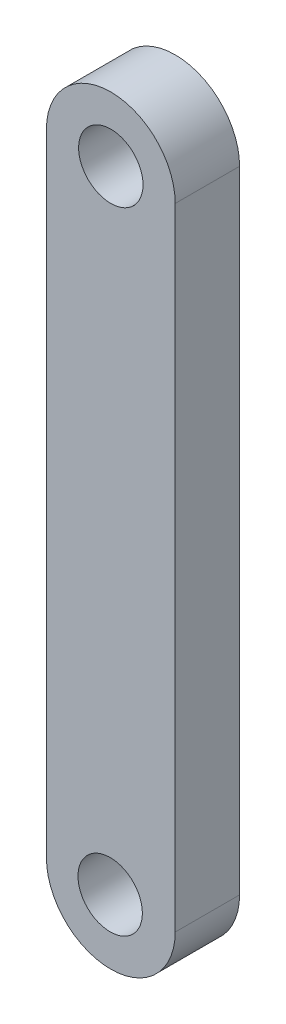
ISO-10303-21;
HEADER;
FILE_DESCRIPTION(('STEP AP214'),'2;1');
FILE_NAME('part.step','',(''),(''),'','','');
FILE_SCHEMA(('AUTOMOTIVE_DESIGN { 1 0 10303 214 1 1 1 1 }'));
ENDSEC;
DATA;
#1=APPLICATION_CONTEXT('core data for automotive mechanical design processes');
#2=APPLICATION_PROTOCOL_DEFINITION('international standard','automotive_design',2000,#1);
#3=PRODUCT_CONTEXT('',#1,'mechanical');
#4=PRODUCT('Part','Part','',(#3));
#5=PRODUCT_RELATED_PRODUCT_CATEGORY('part','',(#4));
#6=PRODUCT_DEFINITION_FORMATION('','',#4);
#7=PRODUCT_DEFINITION_CONTEXT('part definition',#1,'design');
#8=PRODUCT_DEFINITION('design','',#6,#7);
#9=PRODUCT_DEFINITION_SHAPE('','',#8);
#10=(LENGTH_UNIT() NAMED_UNIT(*) SI_UNIT(.MILLI.,.METRE.));
#11=(NAMED_UNIT(*) PLANE_ANGLE_UNIT() SI_UNIT($,.RADIAN.));
#12=(NAMED_UNIT(*) SI_UNIT($,.STERADIAN.) SOLID_ANGLE_UNIT());
#13=UNCERTAINTY_MEASURE_WITH_UNIT(LENGTH_MEASURE(1.E-05),#10,'distance_accuracy_value','');
#14=(GEOMETRIC_REPRESENTATION_CONTEXT(3) GLOBAL_UNCERTAINTY_ASSIGNED_CONTEXT((#13)) GLOBAL_UNIT_ASSIGNED_CONTEXT((#10,
#11,#12)) REPRESENTATION_CONTEXT('',''));
#15=CARTESIAN_POINT('',(0.,0.,0.));
#16=DIRECTION('',(0.,0.,1.));
#17=DIRECTION('',(1.,0.,0.));
#18=AXIS2_PLACEMENT_3D('',#15,#16,#17);
#19=CARTESIAN_POINT('',(0.,0.,2.));
#20=DIRECTION('',(0.,0.,1.));
#21=DIRECTION('',(1.,0.,0.));
#22=AXIS2_PLACEMENT_3D('',#19,#20,#21);
#23=PLANE('',#22);
#24=CARTESIAN_POINT('',(0.,19.6,2.));
#25=DIRECTION('',(0.,0.,1.));
#26=DIRECTION('',(1.,0.,0.));
#27=AXIS2_PLACEMENT_3D('',#24,#25,#26);
#28=CIRCLE('',#27,1.);
#29=CARTESIAN_POINT('',(1.,19.6,2.));
#30=VERTEX_POINT('',#29);
#31=EDGE_CURVE('E112',#30,#30,#28,.T.);
#32=ORIENTED_EDGE('',*,*,#31,.F.);
#33=EDGE_LOOP('',(#32));
#34=FACE_BOUND('',#33,.T.);
#35=CARTESIAN_POINT('',(0.,0.,2.));
#36=DIRECTION('',(0.,0.,1.));
#37=DIRECTION('',(1.,0.,0.));
#38=AXIS2_PLACEMENT_3D('',#35,#36,#37);
#39=CIRCLE('',#38,2.);
#40=CARTESIAN_POINT('',(-2.,0.,2.));
#41=VERTEX_POINT('',#40);
#42=CARTESIAN_POINT('',(2.,0.,2.));
#43=VERTEX_POINT('',#42);
#44=EDGE_CURVE('E92',#41,#43,#39,.T.);
#45=ORIENTED_EDGE('',*,*,#44,.T.);
#46=DIRECTION('',(0.,1.,0.));
#47=VECTOR('',#46,1.);
#48=CARTESIAN_POINT('',(2.,0.,2.));
#49=LINE('',#48,#47);
#50=CARTESIAN_POINT('',(2.,19.6,2.));
#51=VERTEX_POINT('',#50);
#52=EDGE_CURVE('E87',#43,#51,#49,.T.);
#53=ORIENTED_EDGE('',*,*,#52,.T.);
#54=CARTESIAN_POINT('',(0.,19.6,2.));
#55=DIRECTION('',(0.,0.,1.));
#56=DIRECTION('',(1.,0.,0.));
#57=AXIS2_PLACEMENT_3D('',#54,#55,#56);
#58=CIRCLE('',#57,2.);
#59=CARTESIAN_POINT('',(-2.,19.6,2.));
#60=VERTEX_POINT('',#59);
#61=EDGE_CURVE('E90',#51,#60,#58,.T.);
#62=ORIENTED_EDGE('',*,*,#61,.T.);
#63=DIRECTION('',(0.,-1.,0.));
#64=VECTOR('',#63,1.);
#65=CARTESIAN_POINT('',(-2.,0.,2.));
#66=LINE('',#65,#64);
#67=EDGE_CURVE('E57',#60,#41,#66,.T.);
#68=ORIENTED_EDGE('',*,*,#67,.T.);
#69=EDGE_LOOP('',(#45,#53,#62,#68));
#70=FACE_BOUND('',#69,.T.);
#71=CARTESIAN_POINT('',(-0.0195170104792287,-0.00383051409445952,2.));
#72=DIRECTION('',(0.,0.,1.));
#73=DIRECTION('',(1.,0.,0.));
#74=AXIS2_PLACEMENT_3D('',#71,#72,#73);
#75=CIRCLE('',#74,1.00000000000011);
#76=CARTESIAN_POINT('',(0.980482989520881,-0.00383051409445952,2.));
#77=VERTEX_POINT('',#76);
#78=EDGE_CURVE('E134',#77,#77,#75,.T.);
#79=ORIENTED_EDGE('',*,*,#78,.F.);
#80=EDGE_LOOP('',(#79));
#81=FACE_BOUND('',#80,.T.);
#82=ADVANCED_FACE('F39',(#34,#70,#81),#23,.T.);
#83=CARTESIAN_POINT('',(0.,0.,0.));
#84=DIRECTION('',(0.,0.,1.));
#85=DIRECTION('',(1.,0.,0.));
#86=AXIS2_PLACEMENT_3D('',#83,#84,#85);
#87=PLANE('',#86);
#88=CARTESIAN_POINT('',(0.,0.,0.));
#89=DIRECTION('',(0.,0.,1.));
#90=DIRECTION('',(1.,0.,0.));
#91=AXIS2_PLACEMENT_3D('',#88,#89,#90);
#92=CIRCLE('',#91,2.);
#93=CARTESIAN_POINT('',(-2.,0.,0.));
#94=VERTEX_POINT('',#93);
#95=CARTESIAN_POINT('',(2.,0.,0.));
#96=VERTEX_POINT('',#95);
#97=EDGE_CURVE('E108',#94,#96,#92,.T.);
#98=ORIENTED_EDGE('',*,*,#97,.F.);
#99=DIRECTION('',(0.,-1.,0.));
#100=VECTOR('',#99,1.);
#101=CARTESIAN_POINT('',(-2.,0.,0.));
#102=LINE('',#101,#100);
#103=CARTESIAN_POINT('',(-2.,19.6,0.));
#104=VERTEX_POINT('',#103);
#105=EDGE_CURVE('E80',#104,#94,#102,.T.);
#106=ORIENTED_EDGE('',*,*,#105,.F.);
#107=CARTESIAN_POINT('',(0.,19.6,0.));
#108=DIRECTION('',(0.,0.,1.));
#109=DIRECTION('',(1.,0.,0.));
#110=AXIS2_PLACEMENT_3D('',#107,#108,#109);
#111=CIRCLE('',#110,2.);
#112=CARTESIAN_POINT('',(2.,19.6,0.));
#113=VERTEX_POINT('',#112);
#114=EDGE_CURVE('E74',#113,#104,#111,.T.);
#115=ORIENTED_EDGE('',*,*,#114,.F.);
#116=DIRECTION('',(0.,1.,0.));
#117=VECTOR('',#116,1.);
#118=CARTESIAN_POINT('',(2.,0.,0.));
#119=LINE('',#118,#117);
#120=EDGE_CURVE('E97',#96,#113,#119,.T.);
#121=ORIENTED_EDGE('',*,*,#120,.F.);
#122=EDGE_LOOP('',(#98,#106,#115,#121));
#123=FACE_BOUND('',#122,.T.);
#124=CARTESIAN_POINT('',(0.,19.6,0.));
#125=DIRECTION('',(0.,0.,1.));
#126=DIRECTION('',(1.,0.,0.));
#127=AXIS2_PLACEMENT_3D('',#124,#125,#126);
#128=CIRCLE('',#127,1.);
#129=CARTESIAN_POINT('',(1.,19.6,0.));
#130=VERTEX_POINT('',#129);
#131=EDGE_CURVE('E130',#130,#130,#128,.T.);
#132=ORIENTED_EDGE('',*,*,#131,.T.);
#133=EDGE_LOOP('',(#132));
#134=FACE_BOUND('',#133,.T.);
#135=CARTESIAN_POINT('',(-0.0195170104792287,-0.00383051409445952,0.));
#136=DIRECTION('',(0.,0.,1.));
#137=DIRECTION('',(1.,0.,0.));
#138=AXIS2_PLACEMENT_3D('',#135,#136,#137);
#139=CIRCLE('',#138,1.00000000000011);
#140=CARTESIAN_POINT('',(0.980482989520881,-0.00383051409445952,0.));
#141=VERTEX_POINT('',#140);
#142=EDGE_CURVE('E138',#141,#141,#139,.T.);
#143=ORIENTED_EDGE('',*,*,#142,.T.);
#144=EDGE_LOOP('',(#143));
#145=FACE_BOUND('',#144,.T.);
#146=ADVANCED_FACE('F125',(#123,#134,#145),#87,.F.);
#147=CARTESIAN_POINT('',(0.,0.,2.));
#148=DIRECTION('',(0.,0.,-1.));
#149=DIRECTION('',(-1.,0.,0.));
#150=AXIS2_PLACEMENT_3D('',#147,#148,#149);
#151=CYLINDRICAL_SURFACE('',#150,2.);
#152=ORIENTED_EDGE('',*,*,#97,.T.);
#153=DIRECTION('',(0.,0.,-1.));
#154=VECTOR('',#153,1.);
#155=CARTESIAN_POINT('',(2.,0.,2.));
#156=LINE('',#155,#154);
#157=EDGE_CURVE('E11',#43,#96,#156,.T.);
#158=ORIENTED_EDGE('',*,*,#157,.F.);
#159=ORIENTED_EDGE('',*,*,#44,.F.);
#160=DIRECTION('',(0.,0.,-1.));
#161=VECTOR('',#160,1.);
#162=CARTESIAN_POINT('',(-2.,0.,2.));
#163=LINE('',#162,#161);
#164=EDGE_CURVE('E104',#41,#94,#163,.T.);
#165=ORIENTED_EDGE('',*,*,#164,.T.);
#166=EDGE_LOOP('',(#152,#158,#159,#165));
#167=FACE_BOUND('',#166,.T.);
#168=ADVANCED_FACE('F41',(#167),#151,.T.);
#169=CARTESIAN_POINT('',(2.,0.,2.));
#170=DIRECTION('',(-1.,0.,0.));
#171=DIRECTION('',(0.,0.,1.));
#172=AXIS2_PLACEMENT_3D('',#169,#170,#171);
#173=PLANE('',#172);
#174=ORIENTED_EDGE('',*,*,#120,.T.);
#175=DIRECTION('',(0.,0.,-1.));
#176=VECTOR('',#175,1.);
#177=CARTESIAN_POINT('',(2.,19.6,2.));
#178=LINE('',#177,#176);
#179=EDGE_CURVE('E49',#51,#113,#178,.T.);
#180=ORIENTED_EDGE('',*,*,#179,.F.);
#181=ORIENTED_EDGE('',*,*,#52,.F.);
#182=ORIENTED_EDGE('',*,*,#157,.T.);
#183=EDGE_LOOP('',(#174,#180,#181,#182));
#184=FACE_BOUND('',#183,.T.);
#185=ADVANCED_FACE('F96',(#184),#173,.F.);
#186=CARTESIAN_POINT('',(0.,19.6,2.));
#187=DIRECTION('',(0.,0.,-1.));
#188=DIRECTION('',(-1.,0.,0.));
#189=AXIS2_PLACEMENT_3D('',#186,#187,#188);
#190=CYLINDRICAL_SURFACE('',#189,2.);
#191=ORIENTED_EDGE('',*,*,#114,.T.);
#192=DIRECTION('',(0.,0.,-1.));
#193=VECTOR('',#192,1.);
#194=CARTESIAN_POINT('',(-2.,19.6,2.));
#195=LINE('',#194,#193);
#196=EDGE_CURVE('E99',#60,#104,#195,.T.);
#197=ORIENTED_EDGE('',*,*,#196,.F.);
#198=ORIENTED_EDGE('',*,*,#61,.F.);
#199=ORIENTED_EDGE('',*,*,#179,.T.);
#200=EDGE_LOOP('',(#191,#197,#198,#199));
#201=FACE_BOUND('',#200,.T.);
#202=ADVANCED_FACE('F100',(#201),#190,.T.);
#203=CARTESIAN_POINT('',(-2.,0.,2.));
#204=DIRECTION('',(1.,0.,0.));
#205=DIRECTION('',(0.,0.,-1.));
#206=AXIS2_PLACEMENT_3D('',#203,#204,#205);
#207=PLANE('',#206);
#208=ORIENTED_EDGE('',*,*,#105,.T.);
#209=ORIENTED_EDGE('',*,*,#164,.F.);
#210=ORIENTED_EDGE('',*,*,#67,.F.);
#211=ORIENTED_EDGE('',*,*,#196,.T.);
#212=EDGE_LOOP('',(#208,#209,#210,#211));
#213=FACE_BOUND('',#212,.T.);
#214=ADVANCED_FACE('F122',(#213),#207,.F.);
#215=CARTESIAN_POINT('',(0.,19.6,2.));
#216=DIRECTION('',(0.,0.,-1.));
#217=DIRECTION('',(-1.,0.,0.));
#218=AXIS2_PLACEMENT_3D('',#215,#216,#217);
#219=CYLINDRICAL_SURFACE('',#218,1.);
#220=ORIENTED_EDGE('',*,*,#31,.T.);
#221=EDGE_LOOP('',(#220));
#222=FACE_BOUND('',#221,.T.);
#223=ORIENTED_EDGE('',*,*,#131,.F.);
#224=EDGE_LOOP('',(#223));
#225=FACE_BOUND('',#224,.T.);
#226=ADVANCED_FACE('F157',(#222,#225),#219,.F.);
#227=CARTESIAN_POINT('',(-0.0195170104792287,-0.00383051409445952,2.));
#228=DIRECTION('',(0.,0.,-1.));
#229=DIRECTION('',(-1.,0.,0.));
#230=AXIS2_PLACEMENT_3D('',#227,#228,#229);
#231=CYLINDRICAL_SURFACE('',#230,1.00000000000011);
#232=ORIENTED_EDGE('',*,*,#78,.T.);
#233=EDGE_LOOP('',(#232));
#234=FACE_BOUND('',#233,.T.);
#235=ORIENTED_EDGE('',*,*,#142,.F.);
#236=EDGE_LOOP('',(#235));
#237=FACE_BOUND('',#236,.T.);
#238=ADVANCED_FACE('F146',(#234,#237),#231,.F.);
#239=CLOSED_SHELL('',(#82,#146,#168,#185,#202,#214,#226,#238));
#240=MANIFOLD_SOLID_BREP('B2',#239);
#241=ADVANCED_BREP_SHAPE_REPRESENTATION('',(#18,#240),#14);
#242=SHAPE_DEFINITION_REPRESENTATION(#9,#241);
ENDSEC;
END-ISO-10303-21;
